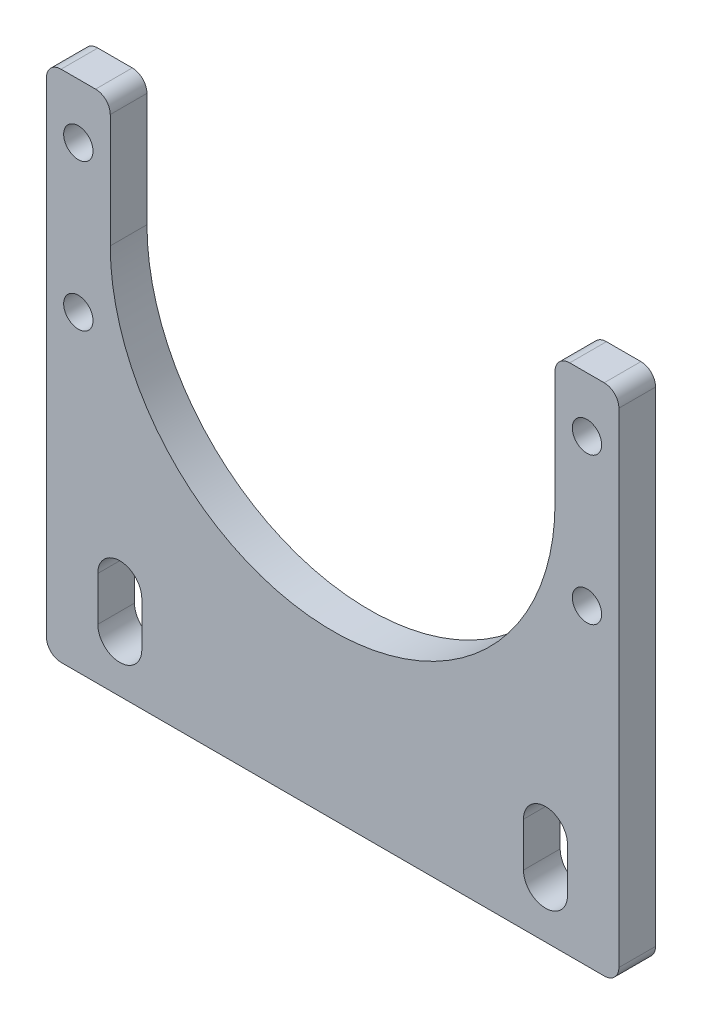
ISO-10303-21;
HEADER;
FILE_DESCRIPTION(('STEP AP214'),'2;1');
FILE_NAME('part.step','',(''),(''),'','','');
FILE_SCHEMA(('AUTOMOTIVE_DESIGN { 1 0 10303 214 1 1 1 1 }'));
ENDSEC;
DATA;
#1=APPLICATION_CONTEXT('core data for automotive mechanical design processes');
#2=APPLICATION_PROTOCOL_DEFINITION('international standard','automotive_design',2000,#1);
#3=PRODUCT_CONTEXT('',#1,'mechanical');
#4=PRODUCT('Part','Part','',(#3));
#5=PRODUCT_RELATED_PRODUCT_CATEGORY('part','',(#4));
#6=PRODUCT_DEFINITION_FORMATION('','',#4);
#7=PRODUCT_DEFINITION_CONTEXT('part definition',#1,'design');
#8=PRODUCT_DEFINITION('design','',#6,#7);
#9=PRODUCT_DEFINITION_SHAPE('','',#8);
#10=(LENGTH_UNIT() NAMED_UNIT(*) SI_UNIT(.MILLI.,.METRE.));
#11=(NAMED_UNIT(*) PLANE_ANGLE_UNIT() SI_UNIT($,.RADIAN.));
#12=(NAMED_UNIT(*) SI_UNIT($,.STERADIAN.) SOLID_ANGLE_UNIT());
#13=UNCERTAINTY_MEASURE_WITH_UNIT(LENGTH_MEASURE(1.E-05),#10,'distance_accuracy_value','');
#14=(GEOMETRIC_REPRESENTATION_CONTEXT(3) GLOBAL_UNCERTAINTY_ASSIGNED_CONTEXT((#13)) GLOBAL_UNIT_ASSIGNED_CONTEXT((#10,
#11,#12)) REPRESENTATION_CONTEXT('',''));
#15=CARTESIAN_POINT('',(0.,0.,0.));
#16=DIRECTION('',(0.,0.,1.));
#17=DIRECTION('',(1.,0.,0.));
#18=AXIS2_PLACEMENT_3D('',#15,#16,#17);
#19=CARTESIAN_POINT('',(0.,29.,5.));
#20=DIRECTION('',(0.,0.,-1.));
#21=DIRECTION('',(-1.,0.,0.));
#22=AXIS2_PLACEMENT_3D('',#19,#20,#21);
#23=CYLINDRICAL_SURFACE('',#22,30.3);
#24=CARTESIAN_POINT('',(0.,29.,0.));
#25=DIRECTION('',(0.,0.,1.));
#26=DIRECTION('',(1.,0.,0.));
#27=AXIS2_PLACEMENT_3D('',#24,#25,#26);
#28=CIRCLE('',#27,30.3);
#29=CARTESIAN_POINT('',(-30.3,29.,0.));
#30=VERTEX_POINT('',#29);
#31=CARTESIAN_POINT('',(30.3,29.,0.));
#32=VERTEX_POINT('',#31);
#33=EDGE_CURVE('E352',#30,#32,#28,.T.);
#34=ORIENTED_EDGE('',*,*,#33,.F.);
#35=DIRECTION('',(0.,0.,-1.));
#36=VECTOR('',#35,1.);
#37=CARTESIAN_POINT('',(-30.3,29.,5.));
#38=LINE('',#37,#36);
#39=CARTESIAN_POINT('',(-30.3,29.,5.));
#40=VERTEX_POINT('',#39);
#41=EDGE_CURVE('E229',#40,#30,#38,.T.);
#42=ORIENTED_EDGE('',*,*,#41,.F.);
#43=CARTESIAN_POINT('',(0.,29.,5.));
#44=DIRECTION('',(0.,0.,1.));
#45=DIRECTION('',(1.,0.,0.));
#46=AXIS2_PLACEMENT_3D('',#43,#44,#45);
#47=CIRCLE('',#46,30.3);
#48=CARTESIAN_POINT('',(30.3,29.,5.));
#49=VERTEX_POINT('',#48);
#50=EDGE_CURVE('E617',#40,#49,#47,.T.);
#51=ORIENTED_EDGE('',*,*,#50,.T.);
#52=DIRECTION('',(0.,0.,-1.));
#53=VECTOR('',#52,1.);
#54=CARTESIAN_POINT('',(30.3,29.,5.));
#55=LINE('',#54,#53);
#56=EDGE_CURVE('E313',#49,#32,#55,.T.);
#57=ORIENTED_EDGE('',*,*,#56,.T.);
#58=EDGE_LOOP('',(#34,#42,#51,#57));
#59=FACE_BOUND('',#58,.T.);
#60=ADVANCED_FACE('F40',(#59),#23,.F.);
#61=CARTESIAN_POINT('',(-30.3,0.,5.));
#62=DIRECTION('',(-1.,0.,0.));
#63=DIRECTION('',(0.,-1.,0.));
#64=AXIS2_PLACEMENT_3D('',#61,#62,#63);
#65=PLANE('',#64);
#66=DIRECTION('',(0.,1.,0.));
#67=VECTOR('',#66,1.);
#68=CARTESIAN_POINT('',(-30.3,0.,0.));
#69=LINE('',#68,#67);
#70=CARTESIAN_POINT('',(-30.3,44.5,0.));
#71=VERTEX_POINT('',#70);
#72=EDGE_CURVE('E355',#30,#71,#69,.T.);
#73=ORIENTED_EDGE('',*,*,#72,.T.);
#74=DIRECTION('',(0.,0.,-1.));
#75=VECTOR('',#74,1.);
#76=CARTESIAN_POINT('',(-30.3,44.5,5.));
#77=LINE('',#76,#75);
#78=CARTESIAN_POINT('',(-30.3,44.5,5.));
#79=VERTEX_POINT('',#78);
#80=EDGE_CURVE('E262',#71,#79,#77,.F.);
#81=ORIENTED_EDGE('',*,*,#80,.T.);
#82=DIRECTION('',(0.,1.,0.));
#83=VECTOR('',#82,1.);
#84=CARTESIAN_POINT('',(-30.3,0.,5.));
#85=LINE('',#84,#83);
#86=EDGE_CURVE('E382',#40,#79,#85,.T.);
#87=ORIENTED_EDGE('',*,*,#86,.F.);
#88=ORIENTED_EDGE('',*,*,#41,.T.);
#89=EDGE_LOOP('',(#73,#81,#87,#88));
#90=FACE_BOUND('',#89,.T.);
#91=ADVANCED_FACE('F422',(#90),#65,.F.);
#92=CARTESIAN_POINT('',(0.,46.5,5.));
#93=DIRECTION('',(0.,1.,0.));
#94=DIRECTION('',(0.,0.,1.));
#95=AXIS2_PLACEMENT_3D('',#92,#93,#94);
#96=PLANE('',#95);
#97=DIRECTION('',(1.,0.,0.));
#98=VECTOR('',#97,1.);
#99=CARTESIAN_POINT('',(0.,46.5,5.));
#100=LINE('',#99,#98);
#101=CARTESIAN_POINT('',(-37.,46.5,5.));
#102=VERTEX_POINT('',#101);
#103=CARTESIAN_POINT('',(-32.3,46.5,5.));
#104=VERTEX_POINT('',#103);
#105=EDGE_CURVE('E375',#102,#104,#100,.T.);
#106=ORIENTED_EDGE('',*,*,#105,.T.);
#107=DIRECTION('',(0.,0.,-1.));
#108=VECTOR('',#107,1.);
#109=CARTESIAN_POINT('',(-32.3,46.5,0.));
#110=LINE('',#109,#108);
#111=CARTESIAN_POINT('',(-32.3,46.5,0.));
#112=VERTEX_POINT('',#111);
#113=EDGE_CURVE('E259',#104,#112,#110,.T.);
#114=ORIENTED_EDGE('',*,*,#113,.T.);
#115=DIRECTION('',(1.,0.,0.));
#116=VECTOR('',#115,1.);
#117=CARTESIAN_POINT('',(0.,46.5,0.));
#118=LINE('',#117,#116);
#119=CARTESIAN_POINT('',(-37.,46.5,0.));
#120=VERTEX_POINT('',#119);
#121=EDGE_CURVE('E296',#120,#112,#118,.T.);
#122=ORIENTED_EDGE('',*,*,#121,.F.);
#123=DIRECTION('',(0.,0.,-1.));
#124=VECTOR('',#123,1.);
#125=CARTESIAN_POINT('',(-37.,46.5,5.));
#126=LINE('',#125,#124);
#127=EDGE_CURVE('E257',#120,#102,#126,.F.);
#128=ORIENTED_EDGE('',*,*,#127,.T.);
#129=EDGE_LOOP('',(#106,#114,#122,#128));
#130=FACE_BOUND('',#129,.T.);
#131=ADVANCED_FACE('F363',(#130),#96,.T.);
#132=CARTESIAN_POINT('',(-39.,0.,5.));
#133=DIRECTION('',(-1.,0.,0.));
#134=DIRECTION('',(0.,0.,1.));
#135=AXIS2_PLACEMENT_3D('',#132,#133,#134);
#136=PLANE('',#135);
#137=DIRECTION('',(0.,1.,0.));
#138=VECTOR('',#137,1.);
#139=CARTESIAN_POINT('',(-39.,0.,5.));
#140=LINE('',#139,#138);
#141=CARTESIAN_POINT('',(-39.,-21.5,5.));
#142=VERTEX_POINT('',#141);
#143=CARTESIAN_POINT('',(-39.,44.5,5.));
#144=VERTEX_POINT('',#143);
#145=EDGE_CURVE('E374',#142,#144,#140,.T.);
#146=ORIENTED_EDGE('',*,*,#145,.T.);
#147=DIRECTION('',(0.,0.,-1.));
#148=VECTOR('',#147,1.);
#149=CARTESIAN_POINT('',(-39.,44.5,5.));
#150=LINE('',#149,#148);
#151=CARTESIAN_POINT('',(-39.,44.5,0.));
#152=VERTEX_POINT('',#151);
#153=EDGE_CURVE('E270',#144,#152,#150,.T.);
#154=ORIENTED_EDGE('',*,*,#153,.T.);
#155=DIRECTION('',(0.,1.,0.));
#156=VECTOR('',#155,1.);
#157=CARTESIAN_POINT('',(-39.,0.,0.));
#158=LINE('',#157,#156);
#159=CARTESIAN_POINT('',(-39.,-21.5,0.));
#160=VERTEX_POINT('',#159);
#161=EDGE_CURVE('E292',#160,#152,#158,.T.);
#162=ORIENTED_EDGE('',*,*,#161,.F.);
#163=DIRECTION('',(0.,0.,-1.));
#164=VECTOR('',#163,1.);
#165=CARTESIAN_POINT('',(-39.,-21.5,5.));
#166=LINE('',#165,#164);
#167=EDGE_CURVE('E268',#160,#142,#166,.F.);
#168=ORIENTED_EDGE('',*,*,#167,.T.);
#169=EDGE_LOOP('',(#146,#154,#162,#168));
#170=FACE_BOUND('',#169,.T.);
#171=ADVANCED_FACE('F377',(#170),#136,.T.);
#172=CARTESIAN_POINT('',(0.,-23.5,5.));
#173=DIRECTION('',(0.,1.,0.));
#174=DIRECTION('',(-1.,0.,0.));
#175=AXIS2_PLACEMENT_3D('',#172,#173,#174);
#176=PLANE('',#175);
#177=DIRECTION('',(1.,0.,0.));
#178=VECTOR('',#177,1.);
#179=CARTESIAN_POINT('',(0.,-23.5,0.));
#180=LINE('',#179,#178);
#181=CARTESIAN_POINT('',(-37.,-23.5,0.));
#182=VERTEX_POINT('',#181);
#183=CARTESIAN_POINT('',(37.,-23.5,0.));
#184=VERTEX_POINT('',#183);
#185=EDGE_CURVE('E279',#182,#184,#180,.T.);
#186=ORIENTED_EDGE('',*,*,#185,.T.);
#187=DIRECTION('',(0.,0.,-1.));
#188=VECTOR('',#187,1.);
#189=CARTESIAN_POINT('',(37.,-23.5,5.));
#190=LINE('',#189,#188);
#191=CARTESIAN_POINT('',(37.,-23.5,5.));
#192=VERTEX_POINT('',#191);
#193=EDGE_CURVE('E11',#184,#192,#190,.F.);
#194=ORIENTED_EDGE('',*,*,#193,.T.);
#195=DIRECTION('',(1.,0.,0.));
#196=VECTOR('',#195,1.);
#197=CARTESIAN_POINT('',(0.,-23.5,5.));
#198=LINE('',#197,#196);
#199=CARTESIAN_POINT('',(-37.,-23.5,5.));
#200=VERTEX_POINT('',#199);
#201=EDGE_CURVE('E281',#200,#192,#198,.T.);
#202=ORIENTED_EDGE('',*,*,#201,.F.);
#203=DIRECTION('',(0.,0.,-1.));
#204=VECTOR('',#203,1.);
#205=CARTESIAN_POINT('',(-37.,-23.5,0.));
#206=LINE('',#205,#204);
#207=EDGE_CURVE('E48',#200,#182,#206,.T.);
#208=ORIENTED_EDGE('',*,*,#207,.T.);
#209=EDGE_LOOP('',(#186,#194,#202,#208));
#210=FACE_BOUND('',#209,.T.);
#211=ADVANCED_FACE('F278',(#210),#176,.F.);
#212=CARTESIAN_POINT('',(39.,0.,5.));
#213=DIRECTION('',(-1.,0.,0.));
#214=DIRECTION('',(0.,-1.,0.));
#215=AXIS2_PLACEMENT_3D('',#212,#213,#214);
#216=PLANE('',#215);
#217=DIRECTION('',(0.,1.,0.));
#218=VECTOR('',#217,1.);
#219=CARTESIAN_POINT('',(39.,0.,0.));
#220=LINE('',#219,#218);
#221=CARTESIAN_POINT('',(39.,-21.5,0.));
#222=VERTEX_POINT('',#221);
#223=CARTESIAN_POINT('',(39.,44.5,0.));
#224=VERTEX_POINT('',#223);
#225=EDGE_CURVE('E291',#222,#224,#220,.T.);
#226=ORIENTED_EDGE('',*,*,#225,.T.);
#227=DIRECTION('',(0.,0.,-1.));
#228=VECTOR('',#227,1.);
#229=CARTESIAN_POINT('',(39.,44.5,5.));
#230=LINE('',#229,#228);
#231=CARTESIAN_POINT('',(39.,44.5,5.));
#232=VERTEX_POINT('',#231);
#233=EDGE_CURVE('E55',#224,#232,#230,.F.);
#234=ORIENTED_EDGE('',*,*,#233,.T.);
#235=DIRECTION('',(0.,1.,0.));
#236=VECTOR('',#235,1.);
#237=CARTESIAN_POINT('',(39.,0.,5.));
#238=LINE('',#237,#236);
#239=CARTESIAN_POINT('',(39.,-21.5,5.));
#240=VERTEX_POINT('',#239);
#241=EDGE_CURVE('E380',#240,#232,#238,.T.);
#242=ORIENTED_EDGE('',*,*,#241,.F.);
#243=DIRECTION('',(0.,0.,-1.));
#244=VECTOR('',#243,1.);
#245=CARTESIAN_POINT('',(39.,-21.5,5.));
#246=LINE('',#245,#244);
#247=EDGE_CURVE('E264',#240,#222,#246,.T.);
#248=ORIENTED_EDGE('',*,*,#247,.T.);
#249=EDGE_LOOP('',(#226,#234,#242,#248));
#250=FACE_BOUND('',#249,.T.);
#251=ADVANCED_FACE('F542',(#250),#216,.F.);
#252=CARTESIAN_POINT('',(0.,46.5,5.));
#253=DIRECTION('',(0.,-1.,0.));
#254=DIRECTION('',(0.,0.,-1.));
#255=AXIS2_PLACEMENT_3D('',#252,#253,#254);
#256=PLANE('',#255);
#257=DIRECTION('',(-1.,0.,0.));
#258=VECTOR('',#257,1.);
#259=CARTESIAN_POINT('',(0.,46.5,0.));
#260=LINE('',#259,#258);
#261=CARTESIAN_POINT('',(37.,46.5,0.));
#262=VERTEX_POINT('',#261);
#263=CARTESIAN_POINT('',(32.3,46.5,0.));
#264=VERTEX_POINT('',#263);
#265=EDGE_CURVE('E294',#262,#264,#260,.T.);
#266=ORIENTED_EDGE('',*,*,#265,.T.);
#267=DIRECTION('',(0.,0.,-1.));
#268=VECTOR('',#267,1.);
#269=CARTESIAN_POINT('',(32.3,46.5,5.));
#270=LINE('',#269,#268);
#271=CARTESIAN_POINT('',(32.3,46.5,5.));
#272=VERTEX_POINT('',#271);
#273=EDGE_CURVE('E244',#264,#272,#270,.F.);
#274=ORIENTED_EDGE('',*,*,#273,.T.);
#275=DIRECTION('',(-1.,0.,0.));
#276=VECTOR('',#275,1.);
#277=CARTESIAN_POINT('',(0.,46.5,5.));
#278=LINE('',#277,#276);
#279=CARTESIAN_POINT('',(37.,46.5,5.));
#280=VERTEX_POINT('',#279);
#281=EDGE_CURVE('E387',#280,#272,#278,.T.);
#282=ORIENTED_EDGE('',*,*,#281,.F.);
#283=DIRECTION('',(0.,0.,-1.));
#284=VECTOR('',#283,1.);
#285=CARTESIAN_POINT('',(37.,46.5,5.));
#286=LINE('',#285,#284);
#287=EDGE_CURVE('E241',#280,#262,#286,.T.);
#288=ORIENTED_EDGE('',*,*,#287,.T.);
#289=EDGE_LOOP('',(#266,#274,#282,#288));
#290=FACE_BOUND('',#289,.T.);
#291=ADVANCED_FACE('F447',(#290),#256,.F.);
#292=CARTESIAN_POINT('',(-29.,-10.5,5.));
#293=DIRECTION('',(0.,0.,-1.));
#294=DIRECTION('',(-1.,0.,0.));
#295=AXIS2_PLACEMENT_3D('',#292,#293,#294);
#296=CYLINDRICAL_SURFACE('',#295,3.);
#297=CARTESIAN_POINT('',(-29.,-10.5,0.));
#298=DIRECTION('',(0.,0.,1.));
#299=DIRECTION('',(1.,0.,0.));
#300=AXIS2_PLACEMENT_3D('',#297,#298,#299);
#301=CIRCLE('',#300,3.);
#302=CARTESIAN_POINT('',(-26.,-10.5,0.));
#303=VERTEX_POINT('',#302);
#304=CARTESIAN_POINT('',(-32.,-10.5,0.));
#305=VERTEX_POINT('',#304);
#306=EDGE_CURVE('E333',#303,#305,#301,.T.);
#307=ORIENTED_EDGE('',*,*,#306,.F.);
#308=DIRECTION('',(0.,0.,-1.));
#309=VECTOR('',#308,1.);
#310=CARTESIAN_POINT('',(-26.,-10.5,5.));
#311=LINE('',#310,#309);
#312=CARTESIAN_POINT('',(-26.,-10.5,5.));
#313=VERTEX_POINT('',#312);
#314=EDGE_CURVE('E315',#313,#303,#311,.T.);
#315=ORIENTED_EDGE('',*,*,#314,.F.);
#316=CARTESIAN_POINT('',(-29.,-10.5,5.));
#317=DIRECTION('',(0.,0.,1.));
#318=DIRECTION('',(1.,0.,0.));
#319=AXIS2_PLACEMENT_3D('',#316,#317,#318);
#320=CIRCLE('',#319,3.);
#321=CARTESIAN_POINT('',(-32.,-10.5,5.));
#322=VERTEX_POINT('',#321);
#323=EDGE_CURVE('E606',#313,#322,#320,.T.);
#324=ORIENTED_EDGE('',*,*,#323,.T.);
#325=DIRECTION('',(0.,0.,-1.));
#326=VECTOR('',#325,1.);
#327=CARTESIAN_POINT('',(-32.,-10.5,5.));
#328=LINE('',#327,#326);
#329=EDGE_CURVE('E217',#322,#305,#328,.T.);
#330=ORIENTED_EDGE('',*,*,#329,.T.);
#331=EDGE_LOOP('',(#307,#315,#324,#330));
#332=FACE_BOUND('',#331,.T.);
#333=ADVANCED_FACE('F444',(#332),#296,.F.);
#334=CARTESIAN_POINT('',(-26.,0.,5.));
#335=DIRECTION('',(1.,0.,0.));
#336=DIRECTION('',(0.,0.,-1.));
#337=AXIS2_PLACEMENT_3D('',#334,#335,#336);
#338=PLANE('',#337);
#339=DIRECTION('',(0.,-1.,0.));
#340=VECTOR('',#339,1.);
#341=CARTESIAN_POINT('',(-26.,0.,0.));
#342=LINE('',#341,#340);
#343=CARTESIAN_POINT('',(-26.,-16.5,0.));
#344=VERTEX_POINT('',#343);
#345=EDGE_CURVE('E343',#303,#344,#342,.T.);
#346=ORIENTED_EDGE('',*,*,#345,.T.);
#347=DIRECTION('',(0.,0.,-1.));
#348=VECTOR('',#347,1.);
#349=CARTESIAN_POINT('',(-26.,-16.5,5.));
#350=LINE('',#349,#348);
#351=CARTESIAN_POINT('',(-26.,-16.5,5.));
#352=VERTEX_POINT('',#351);
#353=EDGE_CURVE('E318',#352,#344,#350,.T.);
#354=ORIENTED_EDGE('',*,*,#353,.F.);
#355=DIRECTION('',(0.,-1.,0.));
#356=VECTOR('',#355,1.);
#357=CARTESIAN_POINT('',(-26.,0.,5.));
#358=LINE('',#357,#356);
#359=EDGE_CURVE('E609',#313,#352,#358,.T.);
#360=ORIENTED_EDGE('',*,*,#359,.F.);
#361=ORIENTED_EDGE('',*,*,#314,.T.);
#362=EDGE_LOOP('',(#346,#354,#360,#361));
#363=FACE_BOUND('',#362,.T.);
#364=ADVANCED_FACE('F440',(#363),#338,.F.);
#365=CARTESIAN_POINT('',(-29.,-16.5,5.));
#366=DIRECTION('',(0.,0.,-1.));
#367=DIRECTION('',(-1.,0.,0.));
#368=AXIS2_PLACEMENT_3D('',#365,#366,#367);
#369=CYLINDRICAL_SURFACE('',#368,3.00000000000001);
#370=CARTESIAN_POINT('',(-29.,-16.5,0.));
#371=DIRECTION('',(0.,0.,1.));
#372=DIRECTION('',(1.,0.,0.));
#373=AXIS2_PLACEMENT_3D('',#370,#371,#372);
#374=CIRCLE('',#373,3.00000000000001);
#375=CARTESIAN_POINT('',(-32.,-16.5,0.));
#376=VERTEX_POINT('',#375);
#377=EDGE_CURVE('E346',#376,#344,#374,.T.);
#378=ORIENTED_EDGE('',*,*,#377,.F.);
#379=DIRECTION('',(0.,0.,-1.));
#380=VECTOR('',#379,1.);
#381=CARTESIAN_POINT('',(-32.,-16.5,5.));
#382=LINE('',#381,#380);
#383=CARTESIAN_POINT('',(-32.,-16.5,5.));
#384=VERTEX_POINT('',#383);
#385=EDGE_CURVE('E219',#384,#376,#382,.T.);
#386=ORIENTED_EDGE('',*,*,#385,.F.);
#387=CARTESIAN_POINT('',(-29.,-16.5,5.));
#388=DIRECTION('',(0.,0.,1.));
#389=DIRECTION('',(1.,0.,0.));
#390=AXIS2_PLACEMENT_3D('',#387,#388,#389);
#391=CIRCLE('',#390,3.00000000000001);
#392=EDGE_CURVE('E611',#384,#352,#391,.T.);
#393=ORIENTED_EDGE('',*,*,#392,.T.);
#394=ORIENTED_EDGE('',*,*,#353,.T.);
#395=EDGE_LOOP('',(#378,#386,#393,#394));
#396=FACE_BOUND('',#395,.T.);
#397=ADVANCED_FACE('F437',(#396),#369,.F.);
#398=CARTESIAN_POINT('',(32.,0.,5.));
#399=DIRECTION('',(1.,0.,0.));
#400=DIRECTION('',(0.,1.,0.));
#401=AXIS2_PLACEMENT_3D('',#398,#399,#400);
#402=PLANE('',#401);
#403=DIRECTION('',(0.,-1.,0.));
#404=VECTOR('',#403,1.);
#405=CARTESIAN_POINT('',(32.,0.,0.));
#406=LINE('',#405,#404);
#407=CARTESIAN_POINT('',(32.,-10.5,0.));
#408=VERTEX_POINT('',#407);
#409=CARTESIAN_POINT('',(32.,-16.5,0.));
#410=VERTEX_POINT('',#409);
#411=EDGE_CURVE('E216',#408,#410,#406,.T.);
#412=ORIENTED_EDGE('',*,*,#411,.T.);
#413=DIRECTION('',(0.,0.,-1.));
#414=VECTOR('',#413,1.);
#415=CARTESIAN_POINT('',(32.,-16.5,5.));
#416=LINE('',#415,#414);
#417=CARTESIAN_POINT('',(32.,-16.5,5.));
#418=VERTEX_POINT('',#417);
#419=EDGE_CURVE('E195',#418,#410,#416,.T.);
#420=ORIENTED_EDGE('',*,*,#419,.F.);
#421=DIRECTION('',(0.,-1.,0.));
#422=VECTOR('',#421,1.);
#423=CARTESIAN_POINT('',(32.,0.,5.));
#424=LINE('',#423,#422);
#425=CARTESIAN_POINT('',(32.,-10.5,5.));
#426=VERTEX_POINT('',#425);
#427=EDGE_CURVE('E202',#426,#418,#424,.T.);
#428=ORIENTED_EDGE('',*,*,#427,.F.);
#429=DIRECTION('',(0.,0.,-1.));
#430=VECTOR('',#429,1.);
#431=CARTESIAN_POINT('',(32.,-10.5,5.));
#432=LINE('',#431,#430);
#433=EDGE_CURVE('E321',#426,#408,#432,.T.);
#434=ORIENTED_EDGE('',*,*,#433,.T.);
#435=EDGE_LOOP('',(#412,#420,#428,#434));
#436=FACE_BOUND('',#435,.T.);
#437=ADVANCED_FACE('F214',(#436),#402,.F.);
#438=CARTESIAN_POINT('',(29.,-16.5,5.));
#439=DIRECTION('',(0.,0.,-1.));
#440=DIRECTION('',(-1.,0.,0.));
#441=AXIS2_PLACEMENT_3D('',#438,#439,#440);
#442=CYLINDRICAL_SURFACE('',#441,3.00000000000001);
#443=CARTESIAN_POINT('',(29.,-16.5,0.));
#444=DIRECTION('',(0.,0.,1.));
#445=DIRECTION('',(1.,0.,0.));
#446=AXIS2_PLACEMENT_3D('',#443,#444,#445);
#447=CIRCLE('',#446,3.00000000000001);
#448=CARTESIAN_POINT('',(26.,-16.5,0.));
#449=VERTEX_POINT('',#448);
#450=EDGE_CURVE('E336',#410,#449,#447,.F.);
#451=ORIENTED_EDGE('',*,*,#450,.T.);
#452=DIRECTION('',(0.,0.,-1.));
#453=VECTOR('',#452,1.);
#454=CARTESIAN_POINT('',(26.,-16.5,5.));
#455=LINE('',#454,#453);
#456=CARTESIAN_POINT('',(26.,-16.5,5.));
#457=VERTEX_POINT('',#456);
#458=EDGE_CURVE('E197',#457,#449,#455,.T.);
#459=ORIENTED_EDGE('',*,*,#458,.F.);
#460=CARTESIAN_POINT('',(29.,-16.5,5.));
#461=DIRECTION('',(0.,0.,1.));
#462=DIRECTION('',(1.,0.,0.));
#463=AXIS2_PLACEMENT_3D('',#460,#461,#462);
#464=CIRCLE('',#463,3.00000000000001);
#465=EDGE_CURVE('E190',#418,#457,#464,.F.);
#466=ORIENTED_EDGE('',*,*,#465,.F.);
#467=ORIENTED_EDGE('',*,*,#419,.T.);
#468=EDGE_LOOP('',(#451,#459,#466,#467));
#469=FACE_BOUND('',#468,.T.);
#470=ADVANCED_FACE('F193',(#469),#442,.F.);
#471=CARTESIAN_POINT('',(26.,0.,5.));
#472=DIRECTION('',(1.,0.,0.));
#473=DIRECTION('',(0.,0.,-1.));
#474=AXIS2_PLACEMENT_3D('',#471,#472,#473);
#475=PLANE('',#474);
#476=DIRECTION('',(0.,-1.,0.));
#477=VECTOR('',#476,1.);
#478=CARTESIAN_POINT('',(26.,0.,0.));
#479=LINE('',#478,#477);
#480=CARTESIAN_POINT('',(26.,-10.5,0.));
#481=VERTEX_POINT('',#480);
#482=EDGE_CURVE('E332',#481,#449,#479,.T.);
#483=ORIENTED_EDGE('',*,*,#482,.F.);
#484=DIRECTION('',(0.,0.,-1.));
#485=VECTOR('',#484,1.);
#486=CARTESIAN_POINT('',(26.,-10.5,5.));
#487=LINE('',#486,#485);
#488=CARTESIAN_POINT('',(26.,-10.5,5.));
#489=VERTEX_POINT('',#488);
#490=EDGE_CURVE('E221',#489,#481,#487,.T.);
#491=ORIENTED_EDGE('',*,*,#490,.F.);
#492=DIRECTION('',(0.,-1.,0.));
#493=VECTOR('',#492,1.);
#494=CARTESIAN_POINT('',(26.,0.,5.));
#495=LINE('',#494,#493);
#496=EDGE_CURVE('E201',#489,#457,#495,.T.);
#497=ORIENTED_EDGE('',*,*,#496,.T.);
#498=ORIENTED_EDGE('',*,*,#458,.T.);
#499=EDGE_LOOP('',(#483,#491,#497,#498));
#500=FACE_BOUND('',#499,.T.);
#501=ADVANCED_FACE('F335',(#500),#475,.T.);
#502=CARTESIAN_POINT('',(34.65,39.,5.));
#503=DIRECTION('',(0.,0.,-1.));
#504=DIRECTION('',(-1.,0.,0.));
#505=AXIS2_PLACEMENT_3D('',#502,#503,#504);
#506=CYLINDRICAL_SURFACE('',#505,2.);
#507=CARTESIAN_POINT('',(34.65,39.,5.));
#508=DIRECTION('',(0.,0.,1.));
#509=DIRECTION('',(1.,0.,0.));
#510=AXIS2_PLACEMENT_3D('',#507,#508,#509);
#511=CIRCLE('',#510,2.);
#512=CARTESIAN_POINT('',(36.65,39.,5.));
#513=VERTEX_POINT('',#512);
#514=EDGE_CURVE('E395',#513,#513,#511,.F.);
#515=ORIENTED_EDGE('',*,*,#514,.F.);
#516=EDGE_LOOP('',(#515));
#517=FACE_BOUND('',#516,.T.);
#518=CARTESIAN_POINT('',(34.65,39.,0.));
#519=DIRECTION('',(0.,0.,1.));
#520=DIRECTION('',(1.,0.,0.));
#521=AXIS2_PLACEMENT_3D('',#518,#519,#520);
#522=CIRCLE('',#521,2.);
#523=CARTESIAN_POINT('',(36.65,39.,0.));
#524=VERTEX_POINT('',#523);
#525=EDGE_CURVE('E307',#524,#524,#522,.F.);
#526=ORIENTED_EDGE('',*,*,#525,.T.);
#527=EDGE_LOOP('',(#526));
#528=FACE_BOUND('',#527,.T.);
#529=ADVANCED_FACE('F452',(#517,#528),#506,.F.);
#530=CARTESIAN_POINT('',(-34.65,19.,5.));
#531=DIRECTION('',(0.,0.,-1.));
#532=DIRECTION('',(-1.,0.,0.));
#533=AXIS2_PLACEMENT_3D('',#530,#531,#532);
#534=CYLINDRICAL_SURFACE('',#533,2.);
#535=CARTESIAN_POINT('',(-34.65,19.,5.));
#536=DIRECTION('',(0.,0.,1.));
#537=DIRECTION('',(1.,0.,0.));
#538=AXIS2_PLACEMENT_3D('',#535,#536,#537);
#539=CIRCLE('',#538,2.);
#540=CARTESIAN_POINT('',(-32.65,19.,5.));
#541=VERTEX_POINT('',#540);
#542=EDGE_CURVE('E392',#541,#541,#539,.F.);
#543=ORIENTED_EDGE('',*,*,#542,.F.);
#544=EDGE_LOOP('',(#543));
#545=FACE_BOUND('',#544,.T.);
#546=CARTESIAN_POINT('',(-34.65,19.,0.));
#547=DIRECTION('',(0.,0.,1.));
#548=DIRECTION('',(1.,0.,0.));
#549=AXIS2_PLACEMENT_3D('',#546,#547,#548);
#550=CIRCLE('',#549,2.);
#551=CARTESIAN_POINT('',(-32.65,19.,0.));
#552=VERTEX_POINT('',#551);
#553=EDGE_CURVE('E304',#552,#552,#550,.F.);
#554=ORIENTED_EDGE('',*,*,#553,.T.);
#555=EDGE_LOOP('',(#554));
#556=FACE_BOUND('',#555,.T.);
#557=ADVANCED_FACE('F473',(#545,#556),#534,.F.);
#558=CARTESIAN_POINT('',(30.3,0.,5.));
#559=DIRECTION('',(-1.,0.,0.));
#560=DIRECTION('',(0.,-1.,0.));
#561=AXIS2_PLACEMENT_3D('',#558,#559,#560);
#562=PLANE('',#561);
#563=DIRECTION('',(0.,1.,0.));
#564=VECTOR('',#563,1.);
#565=CARTESIAN_POINT('',(30.3,0.,5.));
#566=LINE('',#565,#564);
#567=CARTESIAN_POINT('',(30.3,44.5,5.));
#568=VERTEX_POINT('',#567);
#569=EDGE_CURVE('E389',#49,#568,#566,.T.);
#570=ORIENTED_EDGE('',*,*,#569,.T.);
#571=DIRECTION('',(0.,0.,-1.));
#572=VECTOR('',#571,1.);
#573=CARTESIAN_POINT('',(30.3,44.5,0.));
#574=LINE('',#573,#572);
#575=CARTESIAN_POINT('',(30.3,44.5,0.));
#576=VERTEX_POINT('',#575);
#577=EDGE_CURVE('E225',#568,#576,#574,.T.);
#578=ORIENTED_EDGE('',*,*,#577,.T.);
#579=DIRECTION('',(0.,1.,0.));
#580=VECTOR('',#579,1.);
#581=CARTESIAN_POINT('',(30.3,0.,0.));
#582=LINE('',#581,#580);
#583=EDGE_CURVE('E302',#32,#576,#582,.T.);
#584=ORIENTED_EDGE('',*,*,#583,.F.);
#585=ORIENTED_EDGE('',*,*,#56,.F.);
#586=EDGE_LOOP('',(#570,#578,#584,#585));
#587=FACE_BOUND('',#586,.T.);
#588=ADVANCED_FACE('F435',(#587),#562,.T.);
#589=CARTESIAN_POINT('',(-32.,0.,5.));
#590=DIRECTION('',(1.,0.,0.));
#591=DIRECTION('',(0.,1.,0.));
#592=AXIS2_PLACEMENT_3D('',#589,#590,#591);
#593=PLANE('',#592);
#594=DIRECTION('',(0.,-1.,0.));
#595=VECTOR('',#594,1.);
#596=CARTESIAN_POINT('',(-32.,0.,0.));
#597=LINE('',#596,#595);
#598=EDGE_CURVE('E349',#305,#376,#597,.T.);
#599=ORIENTED_EDGE('',*,*,#598,.F.);
#600=ORIENTED_EDGE('',*,*,#329,.F.);
#601=DIRECTION('',(0.,-1.,0.));
#602=VECTOR('',#601,1.);
#603=CARTESIAN_POINT('',(-32.,0.,5.));
#604=LINE('',#603,#602);
#605=EDGE_CURVE('E614',#322,#384,#604,.T.);
#606=ORIENTED_EDGE('',*,*,#605,.T.);
#607=ORIENTED_EDGE('',*,*,#385,.T.);
#608=EDGE_LOOP('',(#599,#600,#606,#607));
#609=FACE_BOUND('',#608,.T.);
#610=ADVANCED_FACE('F416',(#609),#593,.T.);
#611=CARTESIAN_POINT('',(29.,-10.5,5.));
#612=DIRECTION('',(0.,0.,-1.));
#613=DIRECTION('',(-1.,0.,0.));
#614=AXIS2_PLACEMENT_3D('',#611,#612,#613);
#615=CYLINDRICAL_SURFACE('',#614,3.);
#616=CARTESIAN_POINT('',(29.,-10.5,0.));
#617=DIRECTION('',(0.,0.,1.));
#618=DIRECTION('',(1.,0.,0.));
#619=AXIS2_PLACEMENT_3D('',#616,#617,#618);
#620=CIRCLE('',#619,3.);
#621=EDGE_CURVE('E326',#481,#408,#620,.F.);
#622=ORIENTED_EDGE('',*,*,#621,.T.);
#623=ORIENTED_EDGE('',*,*,#433,.F.);
#624=CARTESIAN_POINT('',(29.,-10.5,5.));
#625=DIRECTION('',(0.,0.,1.));
#626=DIRECTION('',(1.,0.,0.));
#627=AXIS2_PLACEMENT_3D('',#624,#625,#626);
#628=CIRCLE('',#627,3.);
#629=EDGE_CURVE('E208',#489,#426,#628,.F.);
#630=ORIENTED_EDGE('',*,*,#629,.F.);
#631=ORIENTED_EDGE('',*,*,#490,.T.);
#632=EDGE_LOOP('',(#622,#623,#630,#631));
#633=FACE_BOUND('',#632,.T.);
#634=ADVANCED_FACE('F325',(#633),#615,.F.);
#635=CARTESIAN_POINT('',(34.65,19.,5.));
#636=DIRECTION('',(0.,0.,-1.));
#637=DIRECTION('',(-1.,0.,0.));
#638=AXIS2_PLACEMENT_3D('',#635,#636,#637);
#639=CYLINDRICAL_SURFACE('',#638,2.);
#640=CARTESIAN_POINT('',(34.65,19.,5.));
#641=DIRECTION('',(0.,0.,1.));
#642=DIRECTION('',(1.,0.,0.));
#643=AXIS2_PLACEMENT_3D('',#640,#641,#642);
#644=CIRCLE('',#643,2.);
#645=CARTESIAN_POINT('',(36.65,19.,5.));
#646=VERTEX_POINT('',#645);
#647=EDGE_CURVE('E212',#646,#646,#644,.T.);
#648=ORIENTED_EDGE('',*,*,#647,.T.);
#649=EDGE_LOOP('',(#648));
#650=FACE_BOUND('',#649,.T.);
#651=CARTESIAN_POINT('',(34.65,19.,0.));
#652=DIRECTION('',(0.,0.,1.));
#653=DIRECTION('',(1.,0.,0.));
#654=AXIS2_PLACEMENT_3D('',#651,#652,#653);
#655=CIRCLE('',#654,2.);
#656=CARTESIAN_POINT('',(36.65,19.,0.));
#657=VERTEX_POINT('',#656);
#658=EDGE_CURVE('E400',#657,#657,#655,.T.);
#659=ORIENTED_EDGE('',*,*,#658,.F.);
#660=EDGE_LOOP('',(#659));
#661=FACE_BOUND('',#660,.T.);
#662=ADVANCED_FACE('F405',(#650,#661),#639,.F.);
#663=CARTESIAN_POINT('',(-34.65,39.,5.));
#664=DIRECTION('',(0.,0.,-1.));
#665=DIRECTION('',(-1.,0.,0.));
#666=AXIS2_PLACEMENT_3D('',#663,#664,#665);
#667=CYLINDRICAL_SURFACE('',#666,2.);
#668=CARTESIAN_POINT('',(-34.65,39.,5.));
#669=DIRECTION('',(0.,0.,1.));
#670=DIRECTION('',(1.,0.,0.));
#671=AXIS2_PLACEMENT_3D('',#668,#669,#670);
#672=CIRCLE('',#671,2.);
#673=CARTESIAN_POINT('',(-32.65,39.,5.));
#674=VERTEX_POINT('',#673);
#675=EDGE_CURVE('E322',#674,#674,#672,.T.);
#676=ORIENTED_EDGE('',*,*,#675,.T.);
#677=EDGE_LOOP('',(#676));
#678=FACE_BOUND('',#677,.T.);
#679=CARTESIAN_POINT('',(-34.65,39.,0.));
#680=DIRECTION('',(0.,0.,1.));
#681=DIRECTION('',(1.,0.,0.));
#682=AXIS2_PLACEMENT_3D('',#679,#680,#681);
#683=CIRCLE('',#682,2.);
#684=CARTESIAN_POINT('',(-32.65,39.,0.));
#685=VERTEX_POINT('',#684);
#686=EDGE_CURVE('E310',#685,#685,#683,.T.);
#687=ORIENTED_EDGE('',*,*,#686,.F.);
#688=EDGE_LOOP('',(#687));
#689=FACE_BOUND('',#688,.T.);
#690=ADVANCED_FACE('F407',(#678,#689),#667,.F.);
#691=CARTESIAN_POINT('',(0.,0.,5.));
#692=DIRECTION('',(0.,0.,1.));
#693=DIRECTION('',(1.,0.,0.));
#694=AXIS2_PLACEMENT_3D('',#691,#692,#693);
#695=PLANE('',#694);
#696=ORIENTED_EDGE('',*,*,#647,.F.);
#697=EDGE_LOOP('',(#696));
#698=FACE_BOUND('',#697,.T.);
#699=ORIENTED_EDGE('',*,*,#427,.T.);
#700=ORIENTED_EDGE('',*,*,#465,.T.);
#701=ORIENTED_EDGE('',*,*,#496,.F.);
#702=ORIENTED_EDGE('',*,*,#629,.T.);
#703=EDGE_LOOP('',(#699,#700,#701,#702));
#704=FACE_BOUND('',#703,.T.);
#705=ORIENTED_EDGE('',*,*,#323,.F.);
#706=ORIENTED_EDGE('',*,*,#359,.T.);
#707=ORIENTED_EDGE('',*,*,#392,.F.);
#708=ORIENTED_EDGE('',*,*,#605,.F.);
#709=EDGE_LOOP('',(#705,#706,#707,#708));
#710=FACE_BOUND('',#709,.T.);
#711=ORIENTED_EDGE('',*,*,#281,.T.);
#712=CARTESIAN_POINT('',(32.3,44.5,5.));
#713=DIRECTION('',(0.,0.,1.));
#714=DIRECTION('',(1.,0.,0.));
#715=AXIS2_PLACEMENT_3D('',#712,#713,#714);
#716=CIRCLE('',#715,2.);
#717=EDGE_CURVE('E255',#272,#568,#716,.T.);
#718=ORIENTED_EDGE('',*,*,#717,.T.);
#719=ORIENTED_EDGE('',*,*,#569,.F.);
#720=ORIENTED_EDGE('',*,*,#50,.F.);
#721=ORIENTED_EDGE('',*,*,#86,.T.);
#722=CARTESIAN_POINT('',(-32.3,44.5,5.));
#723=DIRECTION('',(0.,0.,1.));
#724=DIRECTION('',(1.,0.,0.));
#725=AXIS2_PLACEMENT_3D('',#722,#723,#724);
#726=CIRCLE('',#725,2.);
#727=EDGE_CURVE('E253',#79,#104,#726,.T.);
#728=ORIENTED_EDGE('',*,*,#727,.T.);
#729=ORIENTED_EDGE('',*,*,#105,.F.);
#730=CARTESIAN_POINT('',(-37.,44.5,5.));
#731=DIRECTION('',(0.,0.,1.));
#732=DIRECTION('',(1.,0.,0.));
#733=AXIS2_PLACEMENT_3D('',#730,#731,#732);
#734=CIRCLE('',#733,2.);
#735=EDGE_CURVE('E249',#102,#144,#734,.T.);
#736=ORIENTED_EDGE('',*,*,#735,.T.);
#737=ORIENTED_EDGE('',*,*,#145,.F.);
#738=CARTESIAN_POINT('',(-37.,-21.5,5.));
#739=DIRECTION('',(0.,0.,1.));
#740=DIRECTION('',(1.,0.,0.));
#741=AXIS2_PLACEMENT_3D('',#738,#739,#740);
#742=CIRCLE('',#741,2.);
#743=EDGE_CURVE('E246',#142,#200,#742,.T.);
#744=ORIENTED_EDGE('',*,*,#743,.T.);
#745=ORIENTED_EDGE('',*,*,#201,.T.);
#746=CARTESIAN_POINT('',(37.,-21.5,5.));
#747=DIRECTION('',(0.,0.,1.));
#748=DIRECTION('',(1.,0.,0.));
#749=AXIS2_PLACEMENT_3D('',#746,#747,#748);
#750=CIRCLE('',#749,2.);
#751=EDGE_CURVE('E62',#192,#240,#750,.T.);
#752=ORIENTED_EDGE('',*,*,#751,.T.);
#753=ORIENTED_EDGE('',*,*,#241,.T.);
#754=CARTESIAN_POINT('',(37.,44.5,5.));
#755=DIRECTION('',(0.,0.,1.));
#756=DIRECTION('',(1.,0.,0.));
#757=AXIS2_PLACEMENT_3D('',#754,#755,#756);
#758=CIRCLE('',#757,2.);
#759=EDGE_CURVE('E251',#232,#280,#758,.T.);
#760=ORIENTED_EDGE('',*,*,#759,.T.);
#761=EDGE_LOOP('',(#711,#718,#719,#720,#721,#728,#729,#736,#737,#744,#745,#752,#753,#760));
#762=FACE_BOUND('',#761,.T.);
#763=ORIENTED_EDGE('',*,*,#542,.T.);
#764=EDGE_LOOP('',(#763));
#765=FACE_BOUND('',#764,.T.);
#766=ORIENTED_EDGE('',*,*,#514,.T.);
#767=EDGE_LOOP('',(#766));
#768=FACE_BOUND('',#767,.T.);
#769=ORIENTED_EDGE('',*,*,#675,.F.);
#770=EDGE_LOOP('',(#769));
#771=FACE_BOUND('',#770,.T.);
#772=ADVANCED_FACE('F205',(#698,#704,#710,#762,#765,#768,#771),#695,.T.);
#773=CARTESIAN_POINT('',(0.,0.,0.));
#774=DIRECTION('',(0.,0.,1.));
#775=DIRECTION('',(1.,0.,0.));
#776=AXIS2_PLACEMENT_3D('',#773,#774,#775);
#777=PLANE('',#776);
#778=ORIENTED_EDGE('',*,*,#658,.T.);
#779=EDGE_LOOP('',(#778));
#780=FACE_BOUND('',#779,.T.);
#781=ORIENTED_EDGE('',*,*,#411,.F.);
#782=ORIENTED_EDGE('',*,*,#621,.F.);
#783=ORIENTED_EDGE('',*,*,#482,.T.);
#784=ORIENTED_EDGE('',*,*,#450,.F.);
#785=EDGE_LOOP('',(#781,#782,#783,#784));
#786=FACE_BOUND('',#785,.T.);
#787=ORIENTED_EDGE('',*,*,#306,.T.);
#788=ORIENTED_EDGE('',*,*,#598,.T.);
#789=ORIENTED_EDGE('',*,*,#377,.T.);
#790=ORIENTED_EDGE('',*,*,#345,.F.);
#791=EDGE_LOOP('',(#787,#788,#789,#790));
#792=FACE_BOUND('',#791,.T.);
#793=ORIENTED_EDGE('',*,*,#583,.T.);
#794=CARTESIAN_POINT('',(32.3,44.5,0.));
#795=DIRECTION('',(0.,0.,1.));
#796=DIRECTION('',(1.,0.,0.));
#797=AXIS2_PLACEMENT_3D('',#794,#795,#796);
#798=CIRCLE('',#797,2.);
#799=EDGE_CURVE('E239',#576,#264,#798,.F.);
#800=ORIENTED_EDGE('',*,*,#799,.T.);
#801=ORIENTED_EDGE('',*,*,#265,.F.);
#802=CARTESIAN_POINT('',(37.,44.5,0.));
#803=DIRECTION('',(0.,0.,1.));
#804=DIRECTION('',(1.,0.,0.));
#805=AXIS2_PLACEMENT_3D('',#802,#803,#804);
#806=CIRCLE('',#805,2.);
#807=EDGE_CURVE('E235',#262,#224,#806,.F.);
#808=ORIENTED_EDGE('',*,*,#807,.T.);
#809=ORIENTED_EDGE('',*,*,#225,.F.);
#810=CARTESIAN_POINT('',(37.,-21.5,0.));
#811=DIRECTION('',(0.,0.,1.));
#812=DIRECTION('',(1.,0.,0.));
#813=AXIS2_PLACEMENT_3D('',#810,#811,#812);
#814=CIRCLE('',#813,2.);
#815=EDGE_CURVE('E231',#222,#184,#814,.F.);
#816=ORIENTED_EDGE('',*,*,#815,.T.);
#817=ORIENTED_EDGE('',*,*,#185,.F.);
#818=CARTESIAN_POINT('',(-37.,-21.5,0.));
#819=DIRECTION('',(0.,0.,1.));
#820=DIRECTION('',(1.,0.,0.));
#821=AXIS2_PLACEMENT_3D('',#818,#819,#820);
#822=CIRCLE('',#821,2.);
#823=EDGE_CURVE('E228',#182,#160,#822,.F.);
#824=ORIENTED_EDGE('',*,*,#823,.T.);
#825=ORIENTED_EDGE('',*,*,#161,.T.);
#826=CARTESIAN_POINT('',(-37.,44.5,0.));
#827=DIRECTION('',(0.,0.,1.));
#828=DIRECTION('',(1.,0.,0.));
#829=AXIS2_PLACEMENT_3D('',#826,#827,#828);
#830=CIRCLE('',#829,2.);
#831=EDGE_CURVE('E233',#152,#120,#830,.F.);
#832=ORIENTED_EDGE('',*,*,#831,.T.);
#833=ORIENTED_EDGE('',*,*,#121,.T.);
#834=CARTESIAN_POINT('',(-32.3,44.5,0.));
#835=DIRECTION('',(0.,0.,1.));
#836=DIRECTION('',(1.,0.,0.));
#837=AXIS2_PLACEMENT_3D('',#834,#835,#836);
#838=CIRCLE('',#837,2.);
#839=EDGE_CURVE('E237',#112,#71,#838,.F.);
#840=ORIENTED_EDGE('',*,*,#839,.T.);
#841=ORIENTED_EDGE('',*,*,#72,.F.);
#842=ORIENTED_EDGE('',*,*,#33,.T.);
#843=EDGE_LOOP('',(#793,#800,#801,#808,#809,#816,#817,#824,#825,#832,#833,#840,#841,#842));
#844=FACE_BOUND('',#843,.T.);
#845=ORIENTED_EDGE('',*,*,#553,.F.);
#846=EDGE_LOOP('',(#845));
#847=FACE_BOUND('',#846,.T.);
#848=ORIENTED_EDGE('',*,*,#525,.F.);
#849=EDGE_LOOP('',(#848));
#850=FACE_BOUND('',#849,.T.);
#851=ORIENTED_EDGE('',*,*,#686,.T.);
#852=EDGE_LOOP('',(#851));
#853=FACE_BOUND('',#852,.T.);
#854=ADVANCED_FACE('F286',(#780,#786,#792,#844,#847,#850,#853),#777,.F.);
#855=CARTESIAN_POINT('',(32.3,44.5,5.));
#856=DIRECTION('',(0.,0.,1.));
#857=DIRECTION('',(1.,0.,0.));
#858=AXIS2_PLACEMENT_3D('',#855,#856,#857);
#859=CYLINDRICAL_SURFACE('',#858,2.);
#860=ORIENTED_EDGE('',*,*,#717,.F.);
#861=ORIENTED_EDGE('',*,*,#273,.F.);
#862=ORIENTED_EDGE('',*,*,#799,.F.);
#863=ORIENTED_EDGE('',*,*,#577,.F.);
#864=EDGE_LOOP('',(#860,#861,#862,#863));
#865=FACE_BOUND('',#864,.T.);
#866=ADVANCED_FACE('F598',(#865),#859,.T.);
#867=CARTESIAN_POINT('',(-32.3,44.5,5.));
#868=DIRECTION('',(0.,0.,1.));
#869=DIRECTION('',(1.,0.,0.));
#870=AXIS2_PLACEMENT_3D('',#867,#868,#869);
#871=CYLINDRICAL_SURFACE('',#870,2.);
#872=ORIENTED_EDGE('',*,*,#727,.F.);
#873=ORIENTED_EDGE('',*,*,#80,.F.);
#874=ORIENTED_EDGE('',*,*,#839,.F.);
#875=ORIENTED_EDGE('',*,*,#113,.F.);
#876=EDGE_LOOP('',(#872,#873,#874,#875));
#877=FACE_BOUND('',#876,.T.);
#878=ADVANCED_FACE('F626',(#877),#871,.T.);
#879=CARTESIAN_POINT('',(37.,44.5,5.));
#880=DIRECTION('',(0.,0.,-1.));
#881=DIRECTION('',(-1.,0.,0.));
#882=AXIS2_PLACEMENT_3D('',#879,#880,#881);
#883=CYLINDRICAL_SURFACE('',#882,2.);
#884=ORIENTED_EDGE('',*,*,#759,.F.);
#885=ORIENTED_EDGE('',*,*,#233,.F.);
#886=ORIENTED_EDGE('',*,*,#807,.F.);
#887=ORIENTED_EDGE('',*,*,#287,.F.);
#888=EDGE_LOOP('',(#884,#885,#886,#887));
#889=FACE_BOUND('',#888,.T.);
#890=ADVANCED_FACE('F637',(#889),#883,.T.);
#891=CARTESIAN_POINT('',(-37.,44.5,5.));
#892=DIRECTION('',(0.,0.,-1.));
#893=DIRECTION('',(-1.,0.,0.));
#894=AXIS2_PLACEMENT_3D('',#891,#892,#893);
#895=CYLINDRICAL_SURFACE('',#894,2.);
#896=ORIENTED_EDGE('',*,*,#735,.F.);
#897=ORIENTED_EDGE('',*,*,#127,.F.);
#898=ORIENTED_EDGE('',*,*,#831,.F.);
#899=ORIENTED_EDGE('',*,*,#153,.F.);
#900=EDGE_LOOP('',(#896,#897,#898,#899));
#901=FACE_BOUND('',#900,.T.);
#902=ADVANCED_FACE('F368',(#901),#895,.T.);
#903=CARTESIAN_POINT('',(37.,-21.5,5.));
#904=DIRECTION('',(0.,0.,-1.));
#905=DIRECTION('',(-1.,0.,0.));
#906=AXIS2_PLACEMENT_3D('',#903,#904,#905);
#907=CYLINDRICAL_SURFACE('',#906,2.);
#908=ORIENTED_EDGE('',*,*,#751,.F.);
#909=ORIENTED_EDGE('',*,*,#193,.F.);
#910=ORIENTED_EDGE('',*,*,#815,.F.);
#911=ORIENTED_EDGE('',*,*,#247,.F.);
#912=EDGE_LOOP('',(#908,#909,#910,#911));
#913=FACE_BOUND('',#912,.T.);
#914=ADVANCED_FACE('F640',(#913),#907,.T.);
#915=CARTESIAN_POINT('',(-37.,-21.5,5.));
#916=DIRECTION('',(0.,0.,1.));
#917=DIRECTION('',(1.,0.,0.));
#918=AXIS2_PLACEMENT_3D('',#915,#916,#917);
#919=CYLINDRICAL_SURFACE('',#918,2.);
#920=ORIENTED_EDGE('',*,*,#743,.F.);
#921=ORIENTED_EDGE('',*,*,#167,.F.);
#922=ORIENTED_EDGE('',*,*,#823,.F.);
#923=ORIENTED_EDGE('',*,*,#207,.F.);
#924=EDGE_LOOP('',(#920,#921,#922,#923));
#925=FACE_BOUND('',#924,.T.);
#926=ADVANCED_FACE('F42',(#925),#919,.T.);
#927=CLOSED_SHELL('',(#60,#91,#131,#171,#211,#251,#291,#333,#364,#397,#437,#470,#501,#529,#557,
#588,#610,#634,#662,#690,#772,#854,#866,#878,#890,#902,#914,#926));
#928=MANIFOLD_SOLID_BREP('B2',#927);
#929=ADVANCED_BREP_SHAPE_REPRESENTATION('',(#18,#928),#14);
#930=SHAPE_DEFINITION_REPRESENTATION(#9,#929);
ENDSEC;
END-ISO-10303-21;
